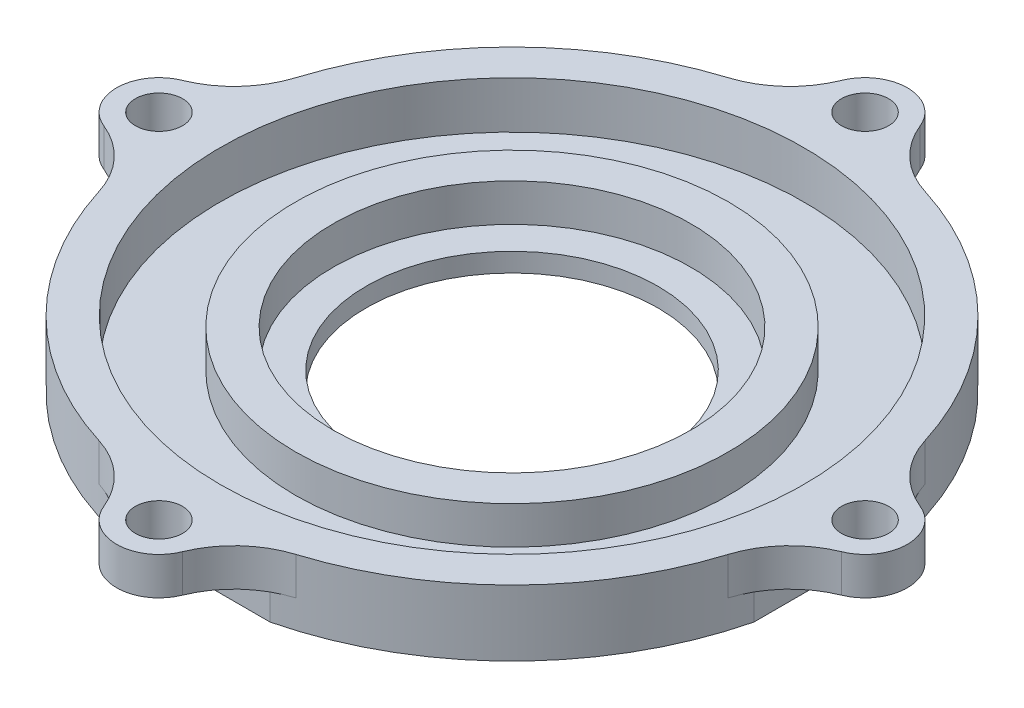
ISO-10303-21;
HEADER;
FILE_DESCRIPTION(('STEP AP214'),'2;1');
FILE_NAME('part.step','',(''),(''),'','','');
FILE_SCHEMA(('AUTOMOTIVE_DESIGN { 1 0 10303 214 1 1 1 1 }'));
ENDSEC;
DATA;
#1=APPLICATION_CONTEXT('core data for automotive mechanical design processes');
#2=APPLICATION_PROTOCOL_DEFINITION('international standard','automotive_design',2000,#1);
#3=PRODUCT_CONTEXT('',#1,'mechanical');
#4=PRODUCT('Part','Part','',(#3));
#5=PRODUCT_RELATED_PRODUCT_CATEGORY('part','',(#4));
#6=PRODUCT_DEFINITION_FORMATION('','',#4);
#7=PRODUCT_DEFINITION_CONTEXT('part definition',#1,'design');
#8=PRODUCT_DEFINITION('design','',#6,#7);
#9=PRODUCT_DEFINITION_SHAPE('','',#8);
#10=(LENGTH_UNIT() NAMED_UNIT(*) SI_UNIT(.MILLI.,.METRE.));
#11=(NAMED_UNIT(*) PLANE_ANGLE_UNIT() SI_UNIT($,.RADIAN.));
#12=(NAMED_UNIT(*) SI_UNIT($,.STERADIAN.) SOLID_ANGLE_UNIT());
#13=UNCERTAINTY_MEASURE_WITH_UNIT(LENGTH_MEASURE(1.E-05),#10,'distance_accuracy_value','');
#14=(GEOMETRIC_REPRESENTATION_CONTEXT(3) GLOBAL_UNCERTAINTY_ASSIGNED_CONTEXT((#13)) GLOBAL_UNIT_ASSIGNED_CONTEXT((#10,
#11,#12)) REPRESENTATION_CONTEXT('',''));
#15=CARTESIAN_POINT('',(0.,0.,0.));
#16=DIRECTION('',(0.,0.,1.));
#17=DIRECTION('',(1.,0.,0.));
#18=AXIS2_PLACEMENT_3D('',#15,#16,#17);
#19=CARTESIAN_POINT('',(0.,3.,0.));
#20=DIRECTION('',(0.,-1.,0.));
#21=DIRECTION('',(0.,0.,-1.));
#22=AXIS2_PLACEMENT_3D('',#19,#20,#21);
#23=CYLINDRICAL_SURFACE('',#22,35.);
#24=CARTESIAN_POINT('',(0.,-1.,0.));
#25=DIRECTION('',(0.,1.,0.));
#26=DIRECTION('',(0.,0.,1.));
#27=AXIS2_PLACEMENT_3D('',#24,#25,#26);
#28=CIRCLE('',#27,35.);
#29=CARTESIAN_POINT('',(34.,-1.,-8.30662386291812));
#30=VERTEX_POINT('',#29);
#31=CARTESIAN_POINT('',(33.4029629629631,-1.,-10.4518929048723));
#32=VERTEX_POINT('',#31);
#33=EDGE_CURVE('E216',#30,#32,#28,.T.);
#34=ORIENTED_EDGE('',*,*,#33,.F.);
#35=DIRECTION('',(0.,-1.,0.));
#36=VECTOR('',#35,1.);
#37=CARTESIAN_POINT('',(34.,15.6433169770934,-8.30662386291812));
#38=LINE('',#37,#36);
#39=CARTESIAN_POINT('',(34.,-4.,-8.30662386291812));
#40=VERTEX_POINT('',#39);
#41=EDGE_CURVE('E200',#30,#40,#38,.T.);
#42=ORIENTED_EDGE('',*,*,#41,.T.);
#43=CARTESIAN_POINT('',(0.,-4.,0.));
#44=DIRECTION('',(0.,-1.,0.));
#45=DIRECTION('',(0.,0.,-1.));
#46=AXIS2_PLACEMENT_3D('',#43,#44,#45);
#47=CIRCLE('',#46,35.);
#48=CARTESIAN_POINT('',(8.30662386291817,-4.,-34.));
#49=VERTEX_POINT('',#48);
#50=EDGE_CURVE('E214',#49,#40,#47,.T.);
#51=ORIENTED_EDGE('',*,*,#50,.F.);
#52=DIRECTION('',(0.,-1.,0.));
#53=VECTOR('',#52,1.);
#54=CARTESIAN_POINT('',(8.30662386291817,15.6433169770934,-34.));
#55=LINE('',#54,#53);
#56=CARTESIAN_POINT('',(8.30662386291817,-1.,-34.));
#57=VERTEX_POINT('',#56);
#58=EDGE_CURVE('E306',#57,#49,#55,.T.);
#59=ORIENTED_EDGE('',*,*,#58,.F.);
#60=CARTESIAN_POINT('',(0.,-1.,0.));
#61=DIRECTION('',(0.,1.,0.));
#62=DIRECTION('',(0.,0.,1.));
#63=AXIS2_PLACEMENT_3D('',#60,#61,#62);
#64=CIRCLE('',#63,35.);
#65=CARTESIAN_POINT('',(10.4518929048726,-1.,-33.4029629629629));
#66=VERTEX_POINT('',#65);
#67=EDGE_CURVE('E355',#66,#57,#64,.T.);
#68=ORIENTED_EDGE('',*,*,#67,.F.);
#69=DIRECTION('',(0.,-1.,0.));
#70=VECTOR('',#69,1.);
#71=CARTESIAN_POINT('',(10.4518929048726,3.,-33.4029629629629));
#72=LINE('',#71,#70);
#73=CARTESIAN_POINT('',(10.4518929048726,3.,-33.4029629629629));
#74=VERTEX_POINT('',#73);
#75=EDGE_CURVE('E386',#66,#74,#72,.F.);
#76=ORIENTED_EDGE('',*,*,#75,.T.);
#77=CARTESIAN_POINT('',(0.,3.,0.));
#78=DIRECTION('',(0.,1.,0.));
#79=DIRECTION('',(0.,0.,1.));
#80=AXIS2_PLACEMENT_3D('',#77,#78,#79);
#81=CIRCLE('',#80,35.);
#82=CARTESIAN_POINT('',(33.402962962963,3.,-10.4518929048723));
#83=VERTEX_POINT('',#82);
#84=EDGE_CURVE('E460',#83,#74,#81,.T.);
#85=ORIENTED_EDGE('',*,*,#84,.F.);
#86=DIRECTION('',(0.,-1.,0.));
#87=VECTOR('',#86,1.);
#88=CARTESIAN_POINT('',(33.4029629629631,3.,-10.4518929048723));
#89=LINE('',#88,#87);
#90=EDGE_CURVE('E384',#83,#32,#89,.T.);
#91=ORIENTED_EDGE('',*,*,#90,.T.);
#92=EDGE_LOOP('',(#34,#42,#51,#59,#68,#76,#85,#91));
#93=FACE_BOUND('',#92,.T.);
#94=ADVANCED_FACE('F37',(#93),#23,.T.);
#95=CARTESIAN_POINT('',(34.,-4.,8.30662386291814));
#96=VERTEX_POINT('',#95);
#97=CARTESIAN_POINT('',(8.30662386291812,-4.,34.));
#98=VERTEX_POINT('',#97);
#99=EDGE_CURVE('E224',#96,#98,#47,.T.);
#100=ORIENTED_EDGE('',*,*,#99,.F.);
#101=DIRECTION('',(0.,-1.,0.));
#102=VECTOR('',#101,1.);
#103=CARTESIAN_POINT('',(34.,15.6433169770934,8.30662386291814));
#104=LINE('',#103,#102);
#105=CARTESIAN_POINT('',(34.,-1.,8.30662386291814));
#106=VERTEX_POINT('',#105);
#107=EDGE_CURVE('E203',#106,#96,#104,.T.);
#108=ORIENTED_EDGE('',*,*,#107,.F.);
#109=CARTESIAN_POINT('',(33.4029629629629,-1.,10.4518929048728));
#110=VERTEX_POINT('',#109);
#111=EDGE_CURVE('E331',#110,#106,#28,.T.);
#112=ORIENTED_EDGE('',*,*,#111,.F.);
#113=DIRECTION('',(0.,-1.,0.));
#114=VECTOR('',#113,1.);
#115=CARTESIAN_POINT('',(33.4029629629629,3.,10.4518929048728));
#116=LINE('',#115,#114);
#117=CARTESIAN_POINT('',(33.4029629629629,3.,10.4518929048727));
#118=VERTEX_POINT('',#117);
#119=EDGE_CURVE('E382',#110,#118,#116,.F.);
#120=ORIENTED_EDGE('',*,*,#119,.T.);
#121=CARTESIAN_POINT('',(10.4518929048722,3.,33.4029629629631));
#122=VERTEX_POINT('',#121);
#123=EDGE_CURVE('E455',#122,#118,#81,.T.);
#124=ORIENTED_EDGE('',*,*,#123,.F.);
#125=DIRECTION('',(0.,-1.,0.));
#126=VECTOR('',#125,1.);
#127=CARTESIAN_POINT('',(10.4518929048722,3.,33.4029629629631));
#128=LINE('',#127,#126);
#129=CARTESIAN_POINT('',(10.4518929048722,-1.,33.4029629629631));
#130=VERTEX_POINT('',#129);
#131=EDGE_CURVE('E379',#122,#130,#128,.T.);
#132=ORIENTED_EDGE('',*,*,#131,.T.);
#133=CARTESIAN_POINT('',(0.,-1.,0.));
#134=DIRECTION('',(0.,1.,0.));
#135=DIRECTION('',(0.,0.,1.));
#136=AXIS2_PLACEMENT_3D('',#133,#134,#135);
#137=CIRCLE('',#136,35.);
#138=CARTESIAN_POINT('',(8.30662386291812,-1.,34.));
#139=VERTEX_POINT('',#138);
#140=EDGE_CURVE('E369',#139,#130,#137,.T.);
#141=ORIENTED_EDGE('',*,*,#140,.F.);
#142=DIRECTION('',(0.,-1.,0.));
#143=VECTOR('',#142,1.);
#144=CARTESIAN_POINT('',(8.30662386291812,15.6433169770934,34.));
#145=LINE('',#144,#143);
#146=EDGE_CURVE('E320',#139,#98,#145,.T.);
#147=ORIENTED_EDGE('',*,*,#146,.T.);
#148=EDGE_LOOP('',(#100,#108,#112,#120,#124,#132,#141,#147));
#149=FACE_BOUND('',#148,.T.);
#150=ADVANCED_FACE('F333',(#149),#23,.T.);
#151=CARTESIAN_POINT('',(-8.30662386291812,-4.,34.));
#152=VERTEX_POINT('',#151);
#153=CARTESIAN_POINT('',(-34.,-4.,8.30662386291817));
#154=VERTEX_POINT('',#153);
#155=EDGE_CURVE('E230',#152,#154,#47,.T.);
#156=ORIENTED_EDGE('',*,*,#155,.F.);
#157=DIRECTION('',(0.,-1.,0.));
#158=VECTOR('',#157,1.);
#159=CARTESIAN_POINT('',(-8.30662386291812,15.6433169770934,34.));
#160=LINE('',#159,#158);
#161=CARTESIAN_POINT('',(-8.30662386291812,-1.,34.));
#162=VERTEX_POINT('',#161);
#163=EDGE_CURVE('E310',#162,#152,#160,.T.);
#164=ORIENTED_EDGE('',*,*,#163,.F.);
#165=CARTESIAN_POINT('',(-10.4518929048729,-1.,33.4029629629629));
#166=VERTEX_POINT('',#165);
#167=EDGE_CURVE('E367',#166,#162,#137,.T.);
#168=ORIENTED_EDGE('',*,*,#167,.F.);
#169=DIRECTION('',(0.,-1.,0.));
#170=VECTOR('',#169,1.);
#171=CARTESIAN_POINT('',(-10.4518929048729,3.,33.4029629629629));
#172=LINE('',#171,#170);
#173=CARTESIAN_POINT('',(-10.4518929048729,3.,33.4029629629629));
#174=VERTEX_POINT('',#173);
#175=EDGE_CURVE('E377',#166,#174,#172,.F.);
#176=ORIENTED_EDGE('',*,*,#175,.T.);
#177=CARTESIAN_POINT('',(-33.402962962963,3.,10.4518929048725));
#178=VERTEX_POINT('',#177);
#179=EDGE_CURVE('E451',#178,#174,#81,.T.);
#180=ORIENTED_EDGE('',*,*,#179,.F.);
#181=DIRECTION('',(0.,-1.,0.));
#182=VECTOR('',#181,1.);
#183=CARTESIAN_POINT('',(-33.402962962963,3.,10.4518929048725));
#184=LINE('',#183,#182);
#185=CARTESIAN_POINT('',(-33.402962962963,-1.,10.4518929048725));
#186=VERTEX_POINT('',#185);
#187=EDGE_CURVE('E375',#178,#186,#184,.T.);
#188=ORIENTED_EDGE('',*,*,#187,.T.);
#189=CARTESIAN_POINT('',(0.,-1.,0.));
#190=DIRECTION('',(0.,1.,0.));
#191=DIRECTION('',(0.,0.,1.));
#192=AXIS2_PLACEMENT_3D('',#189,#190,#191);
#193=CIRCLE('',#192,35.);
#194=CARTESIAN_POINT('',(-34.,-1.,8.30662386291817));
#195=VERTEX_POINT('',#194);
#196=EDGE_CURVE('E344',#195,#186,#193,.T.);
#197=ORIENTED_EDGE('',*,*,#196,.F.);
#198=DIRECTION('',(0.,-1.,0.));
#199=VECTOR('',#198,1.);
#200=CARTESIAN_POINT('',(-34.,15.6433169770934,8.30662386291817));
#201=LINE('',#200,#199);
#202=EDGE_CURVE('E312',#195,#154,#201,.T.);
#203=ORIENTED_EDGE('',*,*,#202,.T.);
#204=EDGE_LOOP('',(#156,#164,#168,#176,#180,#188,#197,#203));
#205=FACE_BOUND('',#204,.T.);
#206=ADVANCED_FACE('F340',(#205),#23,.T.);
#207=CARTESIAN_POINT('',(-40.,3.,0.));
#208=DIRECTION('',(0.,1.,0.));
#209=DIRECTION('',(0.,0.,1.));
#210=AXIS2_PLACEMENT_3D('',#207,#208,#209);
#211=PLANE('',#210);
#212=CARTESIAN_POINT('',(-3.92791650619853E-13,3.,37.5));
#213=DIRECTION('',(0.,1.,0.));
#214=DIRECTION('',(0.,0.,1.));
#215=AXIS2_PLACEMENT_3D('',#212,#213,#214);
#216=CIRCLE('',#215,4.49999999999999);
#217=CARTESIAN_POINT('',(-4.17045973051604,3.,39.1903448275862));
#218=VERTEX_POINT('',#217);
#219=CARTESIAN_POINT('',(4.17045973051522,3.,39.1903448275863));
#220=VERTEX_POINT('',#219);
#221=EDGE_CURVE('E289',#218,#220,#216,.T.);
#222=ORIENTED_EDGE('',*,*,#221,.T.);
#223=CARTESIAN_POINT('',(13.4381480205499,3.,42.9466666666668));
#224=DIRECTION('',(0.,1.,0.));
#225=DIRECTION('',(0.,0.,1.));
#226=AXIS2_PLACEMENT_3D('',#223,#224,#225);
#227=CIRCLE('',#226,10.);
#228=EDGE_CURVE('E429',#220,#122,#227,.F.);
#229=ORIENTED_EDGE('',*,*,#228,.T.);
#230=ORIENTED_EDGE('',*,*,#123,.T.);
#231=CARTESIAN_POINT('',(42.9466666666666,3.,13.4381480205507));
#232=DIRECTION('',(0.,1.,0.));
#233=DIRECTION('',(0.,0.,1.));
#234=AXIS2_PLACEMENT_3D('',#231,#232,#233);
#235=CIRCLE('',#234,10.);
#236=CARTESIAN_POINT('',(39.1903448275862,3.,4.1704597305159));
#237=VERTEX_POINT('',#236);
#238=EDGE_CURVE('E425',#118,#237,#235,.F.);
#239=ORIENTED_EDGE('',*,*,#238,.T.);
#240=CARTESIAN_POINT('',(37.5,3.,2.61861100413235E-13));
#241=DIRECTION('',(0.,1.,0.));
#242=DIRECTION('',(0.,0.,1.));
#243=AXIS2_PLACEMENT_3D('',#240,#241,#242);
#244=CIRCLE('',#243,4.49999999999999);
#245=CARTESIAN_POINT('',(39.1903448275863,3.,-4.17045973051536));
#246=VERTEX_POINT('',#245);
#247=EDGE_CURVE('E281',#237,#246,#244,.T.);
#248=ORIENTED_EDGE('',*,*,#247,.T.);
#249=CARTESIAN_POINT('',(42.9466666666668,3.,-13.4381480205501));
#250=DIRECTION('',(0.,1.,0.));
#251=DIRECTION('',(0.,0.,1.));
#252=AXIS2_PLACEMENT_3D('',#249,#250,#251);
#253=CIRCLE('',#252,10.);
#254=EDGE_CURVE('E421',#246,#83,#253,.F.);
#255=ORIENTED_EDGE('',*,*,#254,.T.);
#256=ORIENTED_EDGE('',*,*,#84,.T.);
#257=CARTESIAN_POINT('',(13.4381480205505,3.,-42.9466666666666));
#258=DIRECTION('',(0.,1.,0.));
#259=DIRECTION('',(0.,0.,1.));
#260=AXIS2_PLACEMENT_3D('',#257,#258,#259);
#261=CIRCLE('',#260,10.);
#262=CARTESIAN_POINT('',(4.17045973051576,3.,-39.1903448275862));
#263=VERTEX_POINT('',#262);
#264=EDGE_CURVE('E417',#74,#263,#261,.F.);
#265=ORIENTED_EDGE('',*,*,#264,.T.);
#266=CARTESIAN_POINT('',(1.30930550206618E-13,3.,-37.5));
#267=DIRECTION('',(0.,1.,0.));
#268=DIRECTION('',(0.,0.,1.));
#269=AXIS2_PLACEMENT_3D('',#266,#267,#268);
#270=CIRCLE('',#269,4.49999999999999);
#271=CARTESIAN_POINT('',(-4.17045973051549,3.,-39.1903448275862));
#272=VERTEX_POINT('',#271);
#273=EDGE_CURVE('E265',#263,#272,#270,.T.);
#274=ORIENTED_EDGE('',*,*,#273,.T.);
#275=CARTESIAN_POINT('',(-13.4381480205502,3.,-42.9466666666667));
#276=DIRECTION('',(0.,1.,0.));
#277=DIRECTION('',(0.,0.,1.));
#278=AXIS2_PLACEMENT_3D('',#275,#276,#277);
#279=CIRCLE('',#278,10.);
#280=CARTESIAN_POINT('',(-10.4518929048724,3.,-33.402962962963));
#281=VERTEX_POINT('',#280);
#282=EDGE_CURVE('E414',#272,#281,#279,.F.);
#283=ORIENTED_EDGE('',*,*,#282,.T.);
#284=CARTESIAN_POINT('',(-33.402962962963,3.,-10.4518929048725));
#285=VERTEX_POINT('',#284);
#286=EDGE_CURVE('E457',#281,#285,#81,.T.);
#287=ORIENTED_EDGE('',*,*,#286,.T.);
#288=CARTESIAN_POINT('',(-42.9466666666667,3.,-13.4381480205504));
#289=DIRECTION('',(0.,1.,0.));
#290=DIRECTION('',(0.,0.,1.));
#291=AXIS2_PLACEMENT_3D('',#288,#289,#290);
#292=CIRCLE('',#291,10.);
#293=CARTESIAN_POINT('',(-39.1903448275862,3.,-4.17045973051563));
#294=VERTEX_POINT('',#293);
#295=EDGE_CURVE('E410',#285,#294,#292,.F.);
#296=ORIENTED_EDGE('',*,*,#295,.T.);
#297=CARTESIAN_POINT('',(-37.5,3.,0.));
#298=DIRECTION('',(0.,1.,0.));
#299=DIRECTION('',(0.,0.,1.));
#300=AXIS2_PLACEMENT_3D('',#297,#298,#299);
#301=CIRCLE('',#300,4.49999999999999);
#302=CARTESIAN_POINT('',(-39.1903448275862,3.,4.17045973051563));
#303=VERTEX_POINT('',#302);
#304=EDGE_CURVE('E257',#294,#303,#301,.T.);
#305=ORIENTED_EDGE('',*,*,#304,.T.);
#306=CARTESIAN_POINT('',(-42.9466666666667,3.,13.4381480205504));
#307=DIRECTION('',(0.,1.,0.));
#308=DIRECTION('',(0.,0.,1.));
#309=AXIS2_PLACEMENT_3D('',#306,#307,#308);
#310=CIRCLE('',#309,10.);
#311=EDGE_CURVE('E11',#303,#178,#310,.F.);
#312=ORIENTED_EDGE('',*,*,#311,.T.);
#313=ORIENTED_EDGE('',*,*,#179,.T.);
#314=CARTESIAN_POINT('',(-13.4381480205508,3.,42.9466666666666));
#315=DIRECTION('',(0.,1.,0.));
#316=DIRECTION('',(0.,0.,1.));
#317=AXIS2_PLACEMENT_3D('',#314,#315,#316);
#318=CIRCLE('',#317,10.);
#319=EDGE_CURVE('E434',#174,#218,#318,.F.);
#320=ORIENTED_EDGE('',*,*,#319,.T.);
#321=EDGE_LOOP('',(#222,#229,#230,#239,#248,#255,#256,#265,#274,#283,#287,#296,#305,#312,#313,#320));
#322=FACE_BOUND('',#321,.T.);
#323=CARTESIAN_POINT('',(0.,3.,0.));
#324=DIRECTION('',(0.,1.,0.));
#325=DIRECTION('',(0.,0.,1.));
#326=AXIS2_PLACEMENT_3D('',#323,#324,#325);
#327=CIRCLE('',#326,31.);
#328=CARTESIAN_POINT('',(0.,3.,31.));
#329=VERTEX_POINT('',#328);
#330=EDGE_CURVE('E228',#329,#329,#327,.T.);
#331=ORIENTED_EDGE('',*,*,#330,.F.);
#332=EDGE_LOOP('',(#331));
#333=FACE_BOUND('',#332,.T.);
#334=CARTESIAN_POINT('',(-37.5,3.,0.));
#335=DIRECTION('',(0.,1.,0.));
#336=DIRECTION('',(0.,0.,1.));
#337=AXIS2_PLACEMENT_3D('',#334,#335,#336);
#338=CIRCLE('',#337,2.5);
#339=CARTESIAN_POINT('',(-37.5,3.,2.5));
#340=VERTEX_POINT('',#339);
#341=EDGE_CURVE('E253',#340,#340,#338,.T.);
#342=ORIENTED_EDGE('',*,*,#341,.F.);
#343=EDGE_LOOP('',(#342));
#344=FACE_BOUND('',#343,.T.);
#345=CARTESIAN_POINT('',(1.30930550206618E-13,3.,-37.5));
#346=DIRECTION('',(0.,1.,0.));
#347=DIRECTION('',(0.,0.,1.));
#348=AXIS2_PLACEMENT_3D('',#345,#346,#347);
#349=CIRCLE('',#348,2.49999999999999);
#350=CARTESIAN_POINT('',(1.30930550206618E-13,3.,-35.));
#351=VERTEX_POINT('',#350);
#352=EDGE_CURVE('E269',#351,#351,#349,.T.);
#353=ORIENTED_EDGE('',*,*,#352,.F.);
#354=EDGE_LOOP('',(#353));
#355=FACE_BOUND('',#354,.T.);
#356=CARTESIAN_POINT('',(37.5,3.,2.61861100413235E-13));
#357=DIRECTION('',(0.,1.,0.));
#358=DIRECTION('',(0.,0.,1.));
#359=AXIS2_PLACEMENT_3D('',#356,#357,#358);
#360=CIRCLE('',#359,2.5);
#361=CARTESIAN_POINT('',(37.5,3.,2.50000000000027));
#362=VERTEX_POINT('',#361);
#363=EDGE_CURVE('E277',#362,#362,#360,.T.);
#364=ORIENTED_EDGE('',*,*,#363,.F.);
#365=EDGE_LOOP('',(#364));
#366=FACE_BOUND('',#365,.T.);
#367=CARTESIAN_POINT('',(-3.92791650619853E-13,3.,37.5));
#368=DIRECTION('',(0.,1.,0.));
#369=DIRECTION('',(0.,0.,1.));
#370=AXIS2_PLACEMENT_3D('',#367,#368,#369);
#371=CIRCLE('',#370,2.5);
#372=CARTESIAN_POINT('',(-3.92791650619853E-13,3.,40.));
#373=VERTEX_POINT('',#372);
#374=EDGE_CURVE('E293',#373,#373,#371,.T.);
#375=ORIENTED_EDGE('',*,*,#374,.F.);
#376=EDGE_LOOP('',(#375));
#377=FACE_BOUND('',#376,.T.);
#378=ADVANCED_FACE('F449',(#322,#333,#344,#355,#366,#377),#211,.T.);
#379=CARTESIAN_POINT('',(0.,-2.,0.));
#380=DIRECTION('',(0.,-1.,0.));
#381=DIRECTION('',(0.,0.,-1.));
#382=AXIS2_PLACEMENT_3D('',#379,#380,#381);
#383=PLANE('',#382);
#384=CARTESIAN_POINT('',(0.,-2.,0.));
#385=DIRECTION('',(0.,-1.,0.));
#386=DIRECTION('',(0.,0.,-1.));
#387=AXIS2_PLACEMENT_3D('',#384,#385,#386);
#388=CIRCLE('',#387,15.5);
#389=CARTESIAN_POINT('',(0.,-2.,-15.5));
#390=VERTEX_POINT('',#389);
#391=EDGE_CURVE('E237',#390,#390,#388,.T.);
#392=ORIENTED_EDGE('',*,*,#391,.T.);
#393=EDGE_LOOP('',(#392));
#394=FACE_BOUND('',#393,.T.);
#395=CARTESIAN_POINT('',(0.,-2.,0.));
#396=DIRECTION('',(0.,1.,0.));
#397=DIRECTION('',(0.,0.,1.));
#398=AXIS2_PLACEMENT_3D('',#395,#396,#397);
#399=CIRCLE('',#398,19.);
#400=CARTESIAN_POINT('',(0.,-2.,19.));
#401=VERTEX_POINT('',#400);
#402=EDGE_CURVE('E247',#401,#401,#399,.T.);
#403=ORIENTED_EDGE('',*,*,#402,.T.);
#404=EDGE_LOOP('',(#403));
#405=FACE_BOUND('',#404,.T.);
#406=ADVANCED_FACE('F473',(#394,#405),#383,.F.);
#407=CARTESIAN_POINT('',(-34.,-4.,-8.30662386291817));
#408=VERTEX_POINT('',#407);
#409=CARTESIAN_POINT('',(-8.30662386291817,-4.,-34.));
#410=VERTEX_POINT('',#409);
#411=EDGE_CURVE('E226',#408,#410,#47,.T.);
#412=ORIENTED_EDGE('',*,*,#411,.F.);
#413=DIRECTION('',(0.,-1.,0.));
#414=VECTOR('',#413,1.);
#415=CARTESIAN_POINT('',(-34.,15.6433169770934,-8.30662386291817));
#416=LINE('',#415,#414);
#417=CARTESIAN_POINT('',(-34.,-1.,-8.30662386291817));
#418=VERTEX_POINT('',#417);
#419=EDGE_CURVE('E301',#418,#408,#416,.T.);
#420=ORIENTED_EDGE('',*,*,#419,.F.);
#421=CARTESIAN_POINT('',(-33.402962962963,-1.,-10.4518929048725));
#422=VERTEX_POINT('',#421);
#423=EDGE_CURVE('E363',#422,#418,#193,.T.);
#424=ORIENTED_EDGE('',*,*,#423,.F.);
#425=DIRECTION('',(0.,-1.,0.));
#426=VECTOR('',#425,1.);
#427=CARTESIAN_POINT('',(-33.402962962963,3.,-10.4518929048725));
#428=LINE('',#427,#426);
#429=EDGE_CURVE('E390',#422,#285,#428,.F.);
#430=ORIENTED_EDGE('',*,*,#429,.T.);
#431=ORIENTED_EDGE('',*,*,#286,.F.);
#432=DIRECTION('',(0.,-1.,0.));
#433=VECTOR('',#432,1.);
#434=CARTESIAN_POINT('',(-10.4518929048724,3.,-33.402962962963));
#435=LINE('',#434,#433);
#436=CARTESIAN_POINT('',(-10.4518929048724,-1.,-33.402962962963));
#437=VERTEX_POINT('',#436);
#438=EDGE_CURVE('E388',#281,#437,#435,.T.);
#439=ORIENTED_EDGE('',*,*,#438,.T.);
#440=CARTESIAN_POINT('',(-8.30662386291817,-1.,-34.));
#441=VERTEX_POINT('',#440);
#442=EDGE_CURVE('E352',#441,#437,#64,.T.);
#443=ORIENTED_EDGE('',*,*,#442,.F.);
#444=DIRECTION('',(0.,-1.,0.));
#445=VECTOR('',#444,1.);
#446=CARTESIAN_POINT('',(-8.30662386291817,15.6433169770934,-34.));
#447=LINE('',#446,#445);
#448=EDGE_CURVE('E303',#441,#410,#447,.T.);
#449=ORIENTED_EDGE('',*,*,#448,.T.);
#450=EDGE_LOOP('',(#412,#420,#424,#430,#431,#439,#443,#449));
#451=FACE_BOUND('',#450,.T.);
#452=ADVANCED_FACE('F349',(#451),#23,.T.);
#453=CARTESIAN_POINT('',(0.,3.,0.));
#454=DIRECTION('',(0.,-1.,0.));
#455=DIRECTION('',(0.,0.,-1.));
#456=AXIS2_PLACEMENT_3D('',#453,#454,#455);
#457=CYLINDRICAL_SURFACE('',#456,31.);
#458=ORIENTED_EDGE('',*,*,#330,.T.);
#459=EDGE_LOOP('',(#458));
#460=FACE_BOUND('',#459,.T.);
#461=CARTESIAN_POINT('',(0.,-2.,0.));
#462=DIRECTION('',(0.,1.,0.));
#463=DIRECTION('',(0.,0.,1.));
#464=AXIS2_PLACEMENT_3D('',#461,#462,#463);
#465=CIRCLE('',#464,31.);
#466=CARTESIAN_POINT('',(0.,-2.,31.));
#467=VERTEX_POINT('',#466);
#468=EDGE_CURVE('E223',#467,#467,#465,.T.);
#469=ORIENTED_EDGE('',*,*,#468,.F.);
#470=EDGE_LOOP('',(#469));
#471=FACE_BOUND('',#470,.T.);
#472=ADVANCED_FACE('F469',(#460,#471),#457,.F.);
#473=CARTESIAN_POINT('',(0.,-2.,0.));
#474=DIRECTION('',(0.,-1.,0.));
#475=DIRECTION('',(0.,0.,-1.));
#476=AXIS2_PLACEMENT_3D('',#473,#474,#475);
#477=CIRCLE('',#476,23.);
#478=CARTESIAN_POINT('',(0.,-2.,-23.));
#479=VERTEX_POINT('',#478);
#480=EDGE_CURVE('E454',#479,#479,#477,.F.);
#481=ORIENTED_EDGE('',*,*,#480,.F.);
#482=EDGE_LOOP('',(#481));
#483=FACE_BOUND('',#482,.T.);
#484=ORIENTED_EDGE('',*,*,#468,.T.);
#485=EDGE_LOOP('',(#484));
#486=FACE_BOUND('',#485,.T.);
#487=ADVANCED_FACE('F517',(#483,#486),#383,.F.);
#488=CARTESIAN_POINT('',(0.,-4.,0.));
#489=DIRECTION('',(0.,-1.,0.));
#490=DIRECTION('',(0.,0.,-1.));
#491=AXIS2_PLACEMENT_3D('',#488,#489,#490);
#492=PLANE('',#491);
#493=DIRECTION('',(0.,0.,-1.));
#494=VECTOR('',#493,1.);
#495=CARTESIAN_POINT('',(34.,-4.,-8.30662386291812));
#496=LINE('',#495,#494);
#497=EDGE_CURVE('E197',#96,#40,#496,.T.);
#498=ORIENTED_EDGE('',*,*,#497,.F.);
#499=ORIENTED_EDGE('',*,*,#99,.T.);
#500=DIRECTION('',(1.,0.,0.));
#501=VECTOR('',#500,1.);
#502=CARTESIAN_POINT('',(-8.30662386291812,-4.,34.));
#503=LINE('',#502,#501);
#504=EDGE_CURVE('E209',#152,#98,#503,.T.);
#505=ORIENTED_EDGE('',*,*,#504,.F.);
#506=ORIENTED_EDGE('',*,*,#155,.T.);
#507=DIRECTION('',(0.,0.,1.));
#508=VECTOR('',#507,1.);
#509=CARTESIAN_POINT('',(-34.,-4.,-8.30662386291817));
#510=LINE('',#509,#508);
#511=EDGE_CURVE('E308',#408,#154,#510,.T.);
#512=ORIENTED_EDGE('',*,*,#511,.F.);
#513=ORIENTED_EDGE('',*,*,#411,.T.);
#514=DIRECTION('',(-1.,0.,0.));
#515=VECTOR('',#514,1.);
#516=CARTESIAN_POINT('',(-8.30662386291817,-4.,-34.));
#517=LINE('',#516,#515);
#518=EDGE_CURVE('E222',#49,#410,#517,.T.);
#519=ORIENTED_EDGE('',*,*,#518,.F.);
#520=ORIENTED_EDGE('',*,*,#50,.T.);
#521=EDGE_LOOP('',(#498,#499,#505,#506,#512,#513,#519,#520));
#522=FACE_BOUND('',#521,.T.);
#523=CARTESIAN_POINT('',(0.,-4.,0.));
#524=DIRECTION('',(0.,-1.,0.));
#525=DIRECTION('',(0.,0.,-1.));
#526=AXIS2_PLACEMENT_3D('',#523,#524,#525);
#527=CIRCLE('',#526,15.5);
#528=CARTESIAN_POINT('',(0.,-4.,-15.5));
#529=VERTEX_POINT('',#528);
#530=EDGE_CURVE('E232',#529,#529,#527,.T.);
#531=ORIENTED_EDGE('',*,*,#530,.F.);
#532=EDGE_LOOP('',(#531));
#533=FACE_BOUND('',#532,.T.);
#534=ADVANCED_FACE('F219',(#522,#533),#492,.T.);
#535=CARTESIAN_POINT('',(0.,-4.,0.));
#536=DIRECTION('',(0.,1.,0.));
#537=DIRECTION('',(0.,0.,1.));
#538=AXIS2_PLACEMENT_3D('',#535,#536,#537);
#539=CYLINDRICAL_SURFACE('',#538,15.5);
#540=ORIENTED_EDGE('',*,*,#530,.T.);
#541=EDGE_LOOP('',(#540));
#542=FACE_BOUND('',#541,.T.);
#543=ORIENTED_EDGE('',*,*,#391,.F.);
#544=EDGE_LOOP('',(#543));
#545=FACE_BOUND('',#544,.T.);
#546=ADVANCED_FACE('F834',(#542,#545),#539,.F.);
#547=CARTESIAN_POINT('',(0.,2.,0.));
#548=DIRECTION('',(0.,1.,0.));
#549=DIRECTION('',(0.,0.,1.));
#550=AXIS2_PLACEMENT_3D('',#547,#548,#549);
#551=PLANE('',#550);
#552=CARTESIAN_POINT('',(0.,2.,0.));
#553=DIRECTION('',(0.,1.,0.));
#554=DIRECTION('',(0.,0.,1.));
#555=AXIS2_PLACEMENT_3D('',#552,#553,#554);
#556=CIRCLE('',#555,23.);
#557=CARTESIAN_POINT('',(0.,2.,23.));
#558=VERTEX_POINT('',#557);
#559=EDGE_CURVE('E242',#558,#558,#556,.T.);
#560=ORIENTED_EDGE('',*,*,#559,.T.);
#561=EDGE_LOOP('',(#560));
#562=FACE_BOUND('',#561,.T.);
#563=CARTESIAN_POINT('',(0.,2.,0.));
#564=DIRECTION('',(0.,1.,0.));
#565=DIRECTION('',(0.,0.,1.));
#566=AXIS2_PLACEMENT_3D('',#563,#564,#565);
#567=CIRCLE('',#566,19.);
#568=CARTESIAN_POINT('',(0.,2.,19.));
#569=VERTEX_POINT('',#568);
#570=EDGE_CURVE('E246',#569,#569,#567,.T.);
#571=ORIENTED_EDGE('',*,*,#570,.F.);
#572=EDGE_LOOP('',(#571));
#573=FACE_BOUND('',#572,.T.);
#574=ADVANCED_FACE('F831',(#562,#573),#551,.T.);
#575=CARTESIAN_POINT('',(0.,2.,0.));
#576=DIRECTION('',(0.,-1.,0.));
#577=DIRECTION('',(0.,0.,-1.));
#578=AXIS2_PLACEMENT_3D('',#575,#576,#577);
#579=CYLINDRICAL_SURFACE('',#578,23.);
#580=ORIENTED_EDGE('',*,*,#559,.F.);
#581=EDGE_LOOP('',(#580));
#582=FACE_BOUND('',#581,.T.);
#583=ORIENTED_EDGE('',*,*,#480,.T.);
#584=EDGE_LOOP('',(#583));
#585=FACE_BOUND('',#584,.T.);
#586=ADVANCED_FACE('F829',(#582,#585),#579,.T.);
#587=CARTESIAN_POINT('',(0.,2.,0.));
#588=DIRECTION('',(0.,-1.,0.));
#589=DIRECTION('',(0.,0.,-1.));
#590=AXIS2_PLACEMENT_3D('',#587,#588,#589);
#591=CYLINDRICAL_SURFACE('',#590,19.);
#592=ORIENTED_EDGE('',*,*,#570,.T.);
#593=EDGE_LOOP('',(#592));
#594=FACE_BOUND('',#593,.T.);
#595=ORIENTED_EDGE('',*,*,#402,.F.);
#596=EDGE_LOOP('',(#595));
#597=FACE_BOUND('',#596,.T.);
#598=ADVANCED_FACE('F826',(#594,#597),#591,.F.);
#599=CARTESIAN_POINT('',(-37.5,-1.,0.));
#600=DIRECTION('',(0.,1.,0.));
#601=DIRECTION('',(0.,0.,1.));
#602=AXIS2_PLACEMENT_3D('',#599,#600,#601);
#603=CYLINDRICAL_SURFACE('',#602,4.49999999999999);
#604=ORIENTED_EDGE('',*,*,#304,.F.);
#605=DIRECTION('',(0.,1.,0.));
#606=VECTOR('',#605,1.);
#607=CARTESIAN_POINT('',(-39.1903448275862,-1.,-4.17045973051563));
#608=LINE('',#607,#606);
#609=CARTESIAN_POINT('',(-39.1903448275862,-1.,-4.17045973051563));
#610=VERTEX_POINT('',#609);
#611=EDGE_CURVE('E372',#294,#610,#608,.F.);
#612=ORIENTED_EDGE('',*,*,#611,.T.);
#613=CARTESIAN_POINT('',(-37.5,-1.,0.));
#614=DIRECTION('',(0.,1.,0.));
#615=DIRECTION('',(0.,0.,1.));
#616=AXIS2_PLACEMENT_3D('',#613,#614,#615);
#617=CIRCLE('',#616,4.49999999999999);
#618=CARTESIAN_POINT('',(-39.1903448275862,-1.,4.17045973051563));
#619=VERTEX_POINT('',#618);
#620=EDGE_CURVE('E256',#610,#619,#617,.T.);
#621=ORIENTED_EDGE('',*,*,#620,.T.);
#622=DIRECTION('',(0.,1.,0.));
#623=VECTOR('',#622,1.);
#624=CARTESIAN_POINT('',(-39.1903448275862,-1.,4.17045973051563));
#625=LINE('',#624,#623);
#626=EDGE_CURVE('E370',#619,#303,#625,.T.);
#627=ORIENTED_EDGE('',*,*,#626,.T.);
#628=EDGE_LOOP('',(#604,#612,#621,#627));
#629=FACE_BOUND('',#628,.T.);
#630=ADVANCED_FACE('F443',(#629),#603,.T.);
#631=CARTESIAN_POINT('',(-37.5,-1.,0.));
#632=DIRECTION('',(0.,1.,0.));
#633=DIRECTION('',(0.,0.,1.));
#634=AXIS2_PLACEMENT_3D('',#631,#632,#633);
#635=CYLINDRICAL_SURFACE('',#634,2.5);
#636=ORIENTED_EDGE('',*,*,#341,.T.);
#637=EDGE_LOOP('',(#636));
#638=FACE_BOUND('',#637,.T.);
#639=CARTESIAN_POINT('',(-37.5,-1.,0.));
#640=DIRECTION('',(0.,1.,0.));
#641=DIRECTION('',(0.,0.,1.));
#642=AXIS2_PLACEMENT_3D('',#639,#640,#641);
#643=CIRCLE('',#642,2.5);
#644=CARTESIAN_POINT('',(-37.5,-1.,2.5));
#645=VERTEX_POINT('',#644);
#646=EDGE_CURVE('E250',#645,#645,#643,.T.);
#647=ORIENTED_EDGE('',*,*,#646,.F.);
#648=EDGE_LOOP('',(#647));
#649=FACE_BOUND('',#648,.T.);
#650=ADVANCED_FACE('F550',(#638,#649),#635,.F.);
#651=CARTESIAN_POINT('',(0.,-1.,0.));
#652=DIRECTION('',(0.,1.,0.));
#653=DIRECTION('',(0.,0.,1.));
#654=AXIS2_PLACEMENT_3D('',#651,#652,#653);
#655=PLANE('',#654);
#656=ORIENTED_EDGE('',*,*,#646,.T.);
#657=EDGE_LOOP('',(#656));
#658=FACE_BOUND('',#657,.T.);
#659=ORIENTED_EDGE('',*,*,#620,.F.);
#660=CARTESIAN_POINT('',(-42.9466666666667,-1.,-13.4381480205504));
#661=DIRECTION('',(0.,1.,0.));
#662=DIRECTION('',(0.,0.,1.));
#663=AXIS2_PLACEMENT_3D('',#660,#661,#662);
#664=CIRCLE('',#663,10.);
#665=EDGE_CURVE('E407',#610,#422,#664,.T.);
#666=ORIENTED_EDGE('',*,*,#665,.T.);
#667=ORIENTED_EDGE('',*,*,#423,.T.);
#668=DIRECTION('',(0.,0.,1.));
#669=VECTOR('',#668,1.);
#670=CARTESIAN_POINT('',(-34.,-1.,-8.30662386291817));
#671=LINE('',#670,#669);
#672=EDGE_CURVE('E52',#418,#195,#671,.T.);
#673=ORIENTED_EDGE('',*,*,#672,.T.);
#674=ORIENTED_EDGE('',*,*,#196,.T.);
#675=CARTESIAN_POINT('',(-42.9466666666667,-1.,13.4381480205504));
#676=DIRECTION('',(0.,1.,0.));
#677=DIRECTION('',(0.,0.,1.));
#678=AXIS2_PLACEMENT_3D('',#675,#676,#677);
#679=CIRCLE('',#678,10.);
#680=EDGE_CURVE('E45',#186,#619,#679,.T.);
#681=ORIENTED_EDGE('',*,*,#680,.T.);
#682=EDGE_LOOP('',(#659,#666,#667,#673,#674,#681));
#683=FACE_BOUND('',#682,.T.);
#684=ADVANCED_FACE('F437',(#658,#683),#655,.F.);
#685=CARTESIAN_POINT('',(1.30930550206618E-13,-1.,-37.5));
#686=DIRECTION('',(0.,1.,0.));
#687=DIRECTION('',(0.,0.,1.));
#688=AXIS2_PLACEMENT_3D('',#685,#686,#687);
#689=CYLINDRICAL_SURFACE('',#688,4.49999999999999);
#690=CARTESIAN_POINT('',(1.30930550206618E-13,-1.,-37.5));
#691=DIRECTION('',(0.,1.,0.));
#692=DIRECTION('',(0.,0.,1.));
#693=AXIS2_PLACEMENT_3D('',#690,#691,#692);
#694=CIRCLE('',#693,4.49999999999999);
#695=CARTESIAN_POINT('',(4.17045973051576,-1.,-39.1903448275862));
#696=VERTEX_POINT('',#695);
#697=CARTESIAN_POINT('',(-4.17045973051549,-1.,-39.1903448275862));
#698=VERTEX_POINT('',#697);
#699=EDGE_CURVE('E260',#696,#698,#694,.T.);
#700=ORIENTED_EDGE('',*,*,#699,.T.);
#701=DIRECTION('',(0.,1.,0.));
#702=VECTOR('',#701,1.);
#703=CARTESIAN_POINT('',(-4.17045973051549,-1.,-39.1903448275862));
#704=LINE('',#703,#702);
#705=EDGE_CURVE('E395',#698,#272,#704,.T.);
#706=ORIENTED_EDGE('',*,*,#705,.T.);
#707=ORIENTED_EDGE('',*,*,#273,.F.);
#708=DIRECTION('',(0.,1.,0.));
#709=VECTOR('',#708,1.);
#710=CARTESIAN_POINT('',(4.17045973051577,-1.,-39.1903448275862));
#711=LINE('',#710,#709);
#712=EDGE_CURVE('E392',#263,#696,#711,.F.);
#713=ORIENTED_EDGE('',*,*,#712,.T.);
#714=EDGE_LOOP('',(#700,#706,#707,#713));
#715=FACE_BOUND('',#714,.T.);
#716=ADVANCED_FACE('F549',(#715),#689,.T.);
#717=CARTESIAN_POINT('',(1.30930550206618E-13,-1.,-37.5));
#718=DIRECTION('',(0.,1.,0.));
#719=DIRECTION('',(0.,0.,1.));
#720=AXIS2_PLACEMENT_3D('',#717,#718,#719);
#721=CYLINDRICAL_SURFACE('',#720,2.49999999999999);
#722=ORIENTED_EDGE('',*,*,#352,.T.);
#723=EDGE_LOOP('',(#722));
#724=FACE_BOUND('',#723,.T.);
#725=CARTESIAN_POINT('',(1.30930550206618E-13,-1.,-37.5));
#726=DIRECTION('',(0.,1.,0.));
#727=DIRECTION('',(0.,0.,1.));
#728=AXIS2_PLACEMENT_3D('',#725,#726,#727);
#729=CIRCLE('',#728,2.49999999999999);
#730=CARTESIAN_POINT('',(1.30930550206618E-13,-1.,-35.));
#731=VERTEX_POINT('',#730);
#732=EDGE_CURVE('E268',#731,#731,#729,.T.);
#733=ORIENTED_EDGE('',*,*,#732,.F.);
#734=EDGE_LOOP('',(#733));
#735=FACE_BOUND('',#734,.T.);
#736=ADVANCED_FACE('F560',(#724,#735),#721,.F.);
#737=CARTESIAN_POINT('',(0.,-1.,0.));
#738=DIRECTION('',(0.,1.,0.));
#739=DIRECTION('',(0.,0.,1.));
#740=AXIS2_PLACEMENT_3D('',#737,#738,#739);
#741=PLANE('',#740);
#742=ORIENTED_EDGE('',*,*,#732,.T.);
#743=EDGE_LOOP('',(#742));
#744=FACE_BOUND('',#743,.T.);
#745=ORIENTED_EDGE('',*,*,#699,.F.);
#746=CARTESIAN_POINT('',(13.4381480205505,-1.,-42.9466666666666));
#747=DIRECTION('',(0.,1.,0.));
#748=DIRECTION('',(0.,0.,1.));
#749=AXIS2_PLACEMENT_3D('',#746,#747,#748);
#750=CIRCLE('',#749,10.);
#751=EDGE_CURVE('E359',#696,#66,#750,.T.);
#752=ORIENTED_EDGE('',*,*,#751,.T.);
#753=ORIENTED_EDGE('',*,*,#67,.T.);
#754=DIRECTION('',(-1.,0.,0.));
#755=VECTOR('',#754,1.);
#756=CARTESIAN_POINT('',(-8.30662386291817,-1.,-34.));
#757=LINE('',#756,#755);
#758=EDGE_CURVE('E60',#57,#441,#757,.T.);
#759=ORIENTED_EDGE('',*,*,#758,.T.);
#760=ORIENTED_EDGE('',*,*,#442,.T.);
#761=CARTESIAN_POINT('',(-13.4381480205502,-1.,-42.9466666666667));
#762=DIRECTION('',(0.,1.,0.));
#763=DIRECTION('',(0.,0.,1.));
#764=AXIS2_PLACEMENT_3D('',#761,#762,#763);
#765=CIRCLE('',#764,10.);
#766=EDGE_CURVE('E412',#437,#698,#765,.T.);
#767=ORIENTED_EDGE('',*,*,#766,.T.);
#768=EDGE_LOOP('',(#745,#752,#753,#759,#760,#767));
#769=FACE_BOUND('',#768,.T.);
#770=ADVANCED_FACE('F358',(#744,#769),#741,.F.);
#771=CARTESIAN_POINT('',(37.5,-1.,2.61861100413235E-13));
#772=DIRECTION('',(0.,1.,0.));
#773=DIRECTION('',(0.,0.,1.));
#774=AXIS2_PLACEMENT_3D('',#771,#772,#773);
#775=CYLINDRICAL_SURFACE('',#774,4.49999999999999);
#776=CARTESIAN_POINT('',(37.5,-1.,2.61861100413235E-13));
#777=DIRECTION('',(0.,1.,0.));
#778=DIRECTION('',(0.,0.,1.));
#779=AXIS2_PLACEMENT_3D('',#776,#777,#778);
#780=CIRCLE('',#779,4.49999999999999);
#781=CARTESIAN_POINT('',(39.1903448275862,-1.,4.1704597305159));
#782=VERTEX_POINT('',#781);
#783=CARTESIAN_POINT('',(39.1903448275863,-1.,-4.17045973051536));
#784=VERTEX_POINT('',#783);
#785=EDGE_CURVE('E280',#782,#784,#780,.T.);
#786=ORIENTED_EDGE('',*,*,#785,.T.);
#787=DIRECTION('',(0.,1.,0.));
#788=VECTOR('',#787,1.);
#789=CARTESIAN_POINT('',(39.1903448275863,-1.,-4.17045973051536));
#790=LINE('',#789,#788);
#791=EDGE_CURVE('E400',#784,#246,#790,.T.);
#792=ORIENTED_EDGE('',*,*,#791,.T.);
#793=ORIENTED_EDGE('',*,*,#247,.F.);
#794=DIRECTION('',(0.,1.,0.));
#795=VECTOR('',#794,1.);
#796=CARTESIAN_POINT('',(39.1903448275862,-1.,4.1704597305159));
#797=LINE('',#796,#795);
#798=EDGE_CURVE('E397',#237,#782,#797,.F.);
#799=ORIENTED_EDGE('',*,*,#798,.T.);
#800=EDGE_LOOP('',(#786,#792,#793,#799));
#801=FACE_BOUND('',#800,.T.);
#802=ADVANCED_FACE('F559',(#801),#775,.T.);
#803=CARTESIAN_POINT('',(37.5,-1.,2.61861100413235E-13));
#804=DIRECTION('',(0.,1.,0.));
#805=DIRECTION('',(0.,0.,1.));
#806=AXIS2_PLACEMENT_3D('',#803,#804,#805);
#807=CYLINDRICAL_SURFACE('',#806,2.5);
#808=ORIENTED_EDGE('',*,*,#363,.T.);
#809=EDGE_LOOP('',(#808));
#810=FACE_BOUND('',#809,.T.);
#811=CARTESIAN_POINT('',(37.5,-1.,2.61861100413235E-13));
#812=DIRECTION('',(0.,1.,0.));
#813=DIRECTION('',(0.,0.,1.));
#814=AXIS2_PLACEMENT_3D('',#811,#812,#813);
#815=CIRCLE('',#814,2.5);
#816=CARTESIAN_POINT('',(37.5,-1.,2.50000000000027));
#817=VERTEX_POINT('',#816);
#818=EDGE_CURVE('E272',#817,#817,#815,.T.);
#819=ORIENTED_EDGE('',*,*,#818,.F.);
#820=EDGE_LOOP('',(#819));
#821=FACE_BOUND('',#820,.T.);
#822=ADVANCED_FACE('F568',(#810,#821),#807,.F.);
#823=CARTESIAN_POINT('',(0.,-1.,0.));
#824=DIRECTION('',(0.,1.,0.));
#825=DIRECTION('',(0.,0.,1.));
#826=AXIS2_PLACEMENT_3D('',#823,#824,#825);
#827=PLANE('',#826);
#828=ORIENTED_EDGE('',*,*,#818,.T.);
#829=EDGE_LOOP('',(#828));
#830=FACE_BOUND('',#829,.T.);
#831=ORIENTED_EDGE('',*,*,#785,.F.);
#832=CARTESIAN_POINT('',(42.9466666666666,-1.,13.4381480205507));
#833=DIRECTION('',(0.,1.,0.));
#834=DIRECTION('',(0.,0.,1.));
#835=AXIS2_PLACEMENT_3D('',#832,#833,#834);
#836=CIRCLE('',#835,10.);
#837=EDGE_CURVE('E423',#782,#110,#836,.T.);
#838=ORIENTED_EDGE('',*,*,#837,.T.);
#839=ORIENTED_EDGE('',*,*,#111,.T.);
#840=DIRECTION('',(0.,0.,-1.));
#841=VECTOR('',#840,1.);
#842=CARTESIAN_POINT('',(34.,-1.,-8.30662386291812));
#843=LINE('',#842,#841);
#844=EDGE_CURVE('E208',#106,#30,#843,.T.);
#845=ORIENTED_EDGE('',*,*,#844,.T.);
#846=ORIENTED_EDGE('',*,*,#33,.T.);
#847=CARTESIAN_POINT('',(42.9466666666668,-1.,-13.4381480205501));
#848=DIRECTION('',(0.,1.,0.));
#849=DIRECTION('',(0.,0.,1.));
#850=AXIS2_PLACEMENT_3D('',#847,#848,#849);
#851=CIRCLE('',#850,10.);
#852=EDGE_CURVE('E419',#32,#784,#851,.T.);
#853=ORIENTED_EDGE('',*,*,#852,.T.);
#854=EDGE_LOOP('',(#831,#838,#839,#845,#846,#853));
#855=FACE_BOUND('',#854,.T.);
#856=ADVANCED_FACE('F328',(#830,#855),#827,.F.);
#857=CARTESIAN_POINT('',(-3.92791650619853E-13,-1.,37.5));
#858=DIRECTION('',(0.,1.,0.));
#859=DIRECTION('',(0.,0.,1.));
#860=AXIS2_PLACEMENT_3D('',#857,#858,#859);
#861=CYLINDRICAL_SURFACE('',#860,4.49999999999999);
#862=CARTESIAN_POINT('',(-3.92791650619853E-13,-1.,37.5));
#863=DIRECTION('',(0.,1.,0.));
#864=DIRECTION('',(0.,0.,1.));
#865=AXIS2_PLACEMENT_3D('',#862,#863,#864);
#866=CIRCLE('',#865,4.49999999999999);
#867=CARTESIAN_POINT('',(-4.17045973051604,-1.,39.1903448275862));
#868=VERTEX_POINT('',#867);
#869=CARTESIAN_POINT('',(4.17045973051522,-1.,39.1903448275863));
#870=VERTEX_POINT('',#869);
#871=EDGE_CURVE('E284',#868,#870,#866,.T.);
#872=ORIENTED_EDGE('',*,*,#871,.T.);
#873=DIRECTION('',(0.,1.,0.));
#874=VECTOR('',#873,1.);
#875=CARTESIAN_POINT('',(4.17045973051522,-1.,39.1903448275863));
#876=LINE('',#875,#874);
#877=EDGE_CURVE('E405',#870,#220,#876,.T.);
#878=ORIENTED_EDGE('',*,*,#877,.T.);
#879=ORIENTED_EDGE('',*,*,#221,.F.);
#880=DIRECTION('',(0.,1.,0.));
#881=VECTOR('',#880,1.);
#882=CARTESIAN_POINT('',(-4.17045973051604,-1.,39.1903448275862));
#883=LINE('',#882,#881);
#884=EDGE_CURVE('E402',#218,#868,#883,.F.);
#885=ORIENTED_EDGE('',*,*,#884,.T.);
#886=EDGE_LOOP('',(#872,#878,#879,#885));
#887=FACE_BOUND('',#886,.T.);
#888=ADVANCED_FACE('F487',(#887),#861,.T.);
#889=CARTESIAN_POINT('',(-3.92791650619853E-13,-1.,37.5));
#890=DIRECTION('',(0.,1.,0.));
#891=DIRECTION('',(0.,0.,1.));
#892=AXIS2_PLACEMENT_3D('',#889,#890,#891);
#893=CYLINDRICAL_SURFACE('',#892,2.5);
#894=ORIENTED_EDGE('',*,*,#374,.T.);
#895=EDGE_LOOP('',(#894));
#896=FACE_BOUND('',#895,.T.);
#897=CARTESIAN_POINT('',(-3.92791650619853E-13,-1.,37.5));
#898=DIRECTION('',(0.,1.,0.));
#899=DIRECTION('',(0.,0.,1.));
#900=AXIS2_PLACEMENT_3D('',#897,#898,#899);
#901=CIRCLE('',#900,2.5);
#902=CARTESIAN_POINT('',(-3.92791650619853E-13,-1.,40.));
#903=VERTEX_POINT('',#902);
#904=EDGE_CURVE('E292',#903,#903,#901,.T.);
#905=ORIENTED_EDGE('',*,*,#904,.F.);
#906=EDGE_LOOP('',(#905));
#907=FACE_BOUND('',#906,.T.);
#908=ADVANCED_FACE('F483',(#896,#907),#893,.F.);
#909=CARTESIAN_POINT('',(0.,-1.,0.));
#910=DIRECTION('',(0.,1.,0.));
#911=DIRECTION('',(0.,0.,1.));
#912=AXIS2_PLACEMENT_3D('',#909,#910,#911);
#913=PLANE('',#912);
#914=DIRECTION('',(1.,0.,0.));
#915=VECTOR('',#914,1.);
#916=CARTESIAN_POINT('',(-8.30662386291812,-1.,34.));
#917=LINE('',#916,#915);
#918=EDGE_CURVE('E317',#162,#139,#917,.T.);
#919=ORIENTED_EDGE('',*,*,#918,.T.);
#920=ORIENTED_EDGE('',*,*,#140,.T.);
#921=CARTESIAN_POINT('',(13.4381480205499,-1.,42.9466666666668));
#922=DIRECTION('',(0.,1.,0.));
#923=DIRECTION('',(0.,0.,1.));
#924=AXIS2_PLACEMENT_3D('',#921,#922,#923);
#925=CIRCLE('',#924,10.);
#926=EDGE_CURVE('E427',#130,#870,#925,.T.);
#927=ORIENTED_EDGE('',*,*,#926,.T.);
#928=ORIENTED_EDGE('',*,*,#871,.F.);
#929=CARTESIAN_POINT('',(-13.4381480205508,-1.,42.9466666666666));
#930=DIRECTION('',(0.,1.,0.));
#931=DIRECTION('',(0.,0.,1.));
#932=AXIS2_PLACEMENT_3D('',#929,#930,#931);
#933=CIRCLE('',#932,10.);
#934=EDGE_CURVE('E431',#868,#166,#933,.T.);
#935=ORIENTED_EDGE('',*,*,#934,.T.);
#936=ORIENTED_EDGE('',*,*,#167,.T.);
#937=EDGE_LOOP('',(#919,#920,#927,#928,#935,#936));
#938=FACE_BOUND('',#937,.T.);
#939=ORIENTED_EDGE('',*,*,#904,.T.);
#940=EDGE_LOOP('',(#939));
#941=FACE_BOUND('',#940,.T.);
#942=ADVANCED_FACE('F486',(#938,#941),#913,.F.);
#943=CARTESIAN_POINT('',(-42.9466666666667,3.,-13.4381480205504));
#944=DIRECTION('',(0.,1.,0.));
#945=DIRECTION('',(0.,0.,1.));
#946=AXIS2_PLACEMENT_3D('',#943,#944,#945);
#947=CYLINDRICAL_SURFACE('',#946,10.);
#948=ORIENTED_EDGE('',*,*,#295,.F.);
#949=ORIENTED_EDGE('',*,*,#429,.F.);
#950=ORIENTED_EDGE('',*,*,#665,.F.);
#951=ORIENTED_EDGE('',*,*,#611,.F.);
#952=EDGE_LOOP('',(#948,#949,#950,#951));
#953=FACE_BOUND('',#952,.T.);
#954=ADVANCED_FACE('F492',(#953),#947,.F.);
#955=CARTESIAN_POINT('',(-13.4381480205502,-1.,-42.9466666666667));
#956=DIRECTION('',(0.,1.,0.));
#957=DIRECTION('',(0.,0.,1.));
#958=AXIS2_PLACEMENT_3D('',#955,#956,#957);
#959=CYLINDRICAL_SURFACE('',#958,10.);
#960=ORIENTED_EDGE('',*,*,#282,.F.);
#961=ORIENTED_EDGE('',*,*,#705,.F.);
#962=ORIENTED_EDGE('',*,*,#766,.F.);
#963=ORIENTED_EDGE('',*,*,#438,.F.);
#964=EDGE_LOOP('',(#960,#961,#962,#963));
#965=FACE_BOUND('',#964,.T.);
#966=ADVANCED_FACE('F500',(#965),#959,.F.);
#967=CARTESIAN_POINT('',(13.4381480205505,3.,-42.9466666666666));
#968=DIRECTION('',(0.,1.,0.));
#969=DIRECTION('',(0.,0.,1.));
#970=AXIS2_PLACEMENT_3D('',#967,#968,#969);
#971=CYLINDRICAL_SURFACE('',#970,10.);
#972=ORIENTED_EDGE('',*,*,#264,.F.);
#973=ORIENTED_EDGE('',*,*,#75,.F.);
#974=ORIENTED_EDGE('',*,*,#751,.F.);
#975=ORIENTED_EDGE('',*,*,#712,.F.);
#976=EDGE_LOOP('',(#972,#973,#974,#975));
#977=FACE_BOUND('',#976,.T.);
#978=ADVANCED_FACE('F704',(#977),#971,.F.);
#979=CARTESIAN_POINT('',(42.9466666666668,-1.,-13.4381480205501));
#980=DIRECTION('',(0.,1.,0.));
#981=DIRECTION('',(0.,0.,1.));
#982=AXIS2_PLACEMENT_3D('',#979,#980,#981);
#983=CYLINDRICAL_SURFACE('',#982,10.);
#984=ORIENTED_EDGE('',*,*,#254,.F.);
#985=ORIENTED_EDGE('',*,*,#791,.F.);
#986=ORIENTED_EDGE('',*,*,#852,.F.);
#987=ORIENTED_EDGE('',*,*,#90,.F.);
#988=EDGE_LOOP('',(#984,#985,#986,#987));
#989=FACE_BOUND('',#988,.T.);
#990=ADVANCED_FACE('F693',(#989),#983,.F.);
#991=CARTESIAN_POINT('',(42.9466666666666,3.,13.4381480205507));
#992=DIRECTION('',(0.,1.,0.));
#993=DIRECTION('',(0.,0.,1.));
#994=AXIS2_PLACEMENT_3D('',#991,#992,#993);
#995=CYLINDRICAL_SURFACE('',#994,10.);
#996=ORIENTED_EDGE('',*,*,#238,.F.);
#997=ORIENTED_EDGE('',*,*,#119,.F.);
#998=ORIENTED_EDGE('',*,*,#837,.F.);
#999=ORIENTED_EDGE('',*,*,#798,.F.);
#1000=EDGE_LOOP('',(#996,#997,#998,#999));
#1001=FACE_BOUND('',#1000,.T.);
#1002=ADVANCED_FACE('F682',(#1001),#995,.F.);
#1003=CARTESIAN_POINT('',(13.4381480205499,-1.,42.9466666666668));
#1004=DIRECTION('',(0.,1.,0.));
#1005=DIRECTION('',(0.,0.,1.));
#1006=AXIS2_PLACEMENT_3D('',#1003,#1004,#1005);
#1007=CYLINDRICAL_SURFACE('',#1006,10.);
#1008=ORIENTED_EDGE('',*,*,#228,.F.);
#1009=ORIENTED_EDGE('',*,*,#877,.F.);
#1010=ORIENTED_EDGE('',*,*,#926,.F.);
#1011=ORIENTED_EDGE('',*,*,#131,.F.);
#1012=EDGE_LOOP('',(#1008,#1009,#1010,#1011));
#1013=FACE_BOUND('',#1012,.T.);
#1014=ADVANCED_FACE('F672',(#1013),#1007,.F.);
#1015=CARTESIAN_POINT('',(-13.4381480205508,3.,42.9466666666666));
#1016=DIRECTION('',(0.,1.,0.));
#1017=DIRECTION('',(0.,0.,1.));
#1018=AXIS2_PLACEMENT_3D('',#1015,#1016,#1017);
#1019=CYLINDRICAL_SURFACE('',#1018,10.);
#1020=ORIENTED_EDGE('',*,*,#319,.F.);
#1021=ORIENTED_EDGE('',*,*,#175,.F.);
#1022=ORIENTED_EDGE('',*,*,#934,.F.);
#1023=ORIENTED_EDGE('',*,*,#884,.F.);
#1024=EDGE_LOOP('',(#1020,#1021,#1022,#1023));
#1025=FACE_BOUND('',#1024,.T.);
#1026=ADVANCED_FACE('F663',(#1025),#1019,.F.);
#1027=CARTESIAN_POINT('',(-42.9466666666667,-1.,13.4381480205504));
#1028=DIRECTION('',(0.,1.,0.));
#1029=DIRECTION('',(0.,0.,1.));
#1030=AXIS2_PLACEMENT_3D('',#1027,#1028,#1029);
#1031=CYLINDRICAL_SURFACE('',#1030,10.);
#1032=ORIENTED_EDGE('',*,*,#311,.F.);
#1033=ORIENTED_EDGE('',*,*,#626,.F.);
#1034=ORIENTED_EDGE('',*,*,#680,.F.);
#1035=ORIENTED_EDGE('',*,*,#187,.F.);
#1036=EDGE_LOOP('',(#1032,#1033,#1034,#1035));
#1037=FACE_BOUND('',#1036,.T.);
#1038=ADVANCED_FACE('F39',(#1037),#1031,.F.);
#1039=CARTESIAN_POINT('',(-8.30662386291812,15.6433169770934,34.));
#1040=DIRECTION('',(0.,0.,-1.));
#1041=DIRECTION('',(-1.,0.,0.));
#1042=AXIS2_PLACEMENT_3D('',#1039,#1040,#1041);
#1043=PLANE('',#1042);
#1044=ORIENTED_EDGE('',*,*,#163,.T.);
#1045=ORIENTED_EDGE('',*,*,#504,.T.);
#1046=ORIENTED_EDGE('',*,*,#146,.F.);
#1047=ORIENTED_EDGE('',*,*,#918,.F.);
#1048=EDGE_LOOP('',(#1044,#1045,#1046,#1047));
#1049=FACE_BOUND('',#1048,.T.);
#1050=ADVANCED_FACE('F590',(#1049),#1043,.F.);
#1051=CARTESIAN_POINT('',(34.,15.6433169770934,-8.30662386291812));
#1052=DIRECTION('',(-1.,0.,0.));
#1053=DIRECTION('',(0.,0.,1.));
#1054=AXIS2_PLACEMENT_3D('',#1051,#1052,#1053);
#1055=PLANE('',#1054);
#1056=ORIENTED_EDGE('',*,*,#107,.T.);
#1057=ORIENTED_EDGE('',*,*,#497,.T.);
#1058=ORIENTED_EDGE('',*,*,#41,.F.);
#1059=ORIENTED_EDGE('',*,*,#844,.F.);
#1060=EDGE_LOOP('',(#1056,#1057,#1058,#1059));
#1061=FACE_BOUND('',#1060,.T.);
#1062=ADVANCED_FACE('F199',(#1061),#1055,.F.);
#1063=CARTESIAN_POINT('',(-8.30662386291817,15.6433169770934,-34.));
#1064=DIRECTION('',(0.,0.,1.));
#1065=DIRECTION('',(1.,0.,0.));
#1066=AXIS2_PLACEMENT_3D('',#1063,#1064,#1065);
#1067=PLANE('',#1066);
#1068=ORIENTED_EDGE('',*,*,#58,.T.);
#1069=ORIENTED_EDGE('',*,*,#518,.T.);
#1070=ORIENTED_EDGE('',*,*,#448,.F.);
#1071=ORIENTED_EDGE('',*,*,#758,.F.);
#1072=EDGE_LOOP('',(#1068,#1069,#1070,#1071));
#1073=FACE_BOUND('',#1072,.T.);
#1074=ADVANCED_FACE('F354',(#1073),#1067,.F.);
#1075=CARTESIAN_POINT('',(-34.,15.6433169770934,-8.30662386291817));
#1076=DIRECTION('',(1.,0.,0.));
#1077=DIRECTION('',(0.,0.,-1.));
#1078=AXIS2_PLACEMENT_3D('',#1075,#1076,#1077);
#1079=PLANE('',#1078);
#1080=ORIENTED_EDGE('',*,*,#419,.T.);
#1081=ORIENTED_EDGE('',*,*,#511,.T.);
#1082=ORIENTED_EDGE('',*,*,#202,.F.);
#1083=ORIENTED_EDGE('',*,*,#672,.F.);
#1084=EDGE_LOOP('',(#1080,#1081,#1082,#1083));
#1085=FACE_BOUND('',#1084,.T.);
#1086=ADVANCED_FACE('F346',(#1085),#1079,.F.);
#1087=CLOSED_SHELL('',(#94,#150,#206,#378,#406,#452,#472,#487,#534,#546,#574,#586,#598,#630,
#650,#684,#716,#736,#770,#802,#822,#856,#888,#908,#942,#954,#966,#978,#990,#1002,#1014,#1026,
#1038,#1050,#1062,#1074,#1086));
#1088=MANIFOLD_SOLID_BREP('B2',#1087);
#1089=ADVANCED_BREP_SHAPE_REPRESENTATION('',(#18,#1088),#14);
#1090=SHAPE_DEFINITION_REPRESENTATION(#9,#1089);
ENDSEC;
END-ISO-10303-21;
